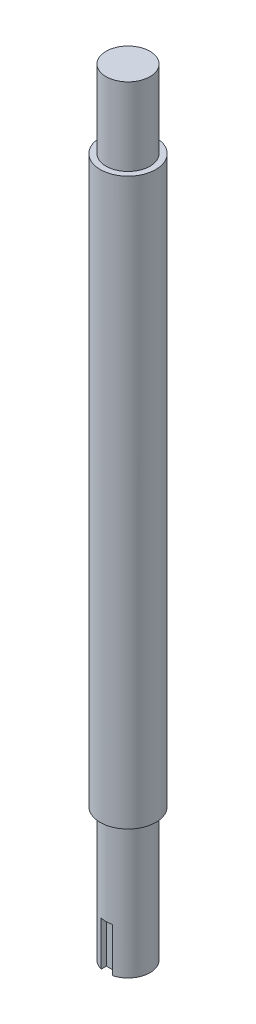
ISO-10303-21;
HEADER;
FILE_DESCRIPTION(('STEP AP214'),'2;1');
FILE_NAME('part.step','',(''),(''),'','','');
FILE_SCHEMA(('AUTOMOTIVE_DESIGN { 1 0 10303 214 1 1 1 1 }'));
ENDSEC;
DATA;
#1=APPLICATION_CONTEXT('core data for automotive mechanical design processes');
#2=APPLICATION_PROTOCOL_DEFINITION('international standard','automotive_design',2000,#1);
#3=PRODUCT_CONTEXT('',#1,'mechanical');
#4=PRODUCT('Part','Part','',(#3));
#5=PRODUCT_RELATED_PRODUCT_CATEGORY('part','',(#4));
#6=PRODUCT_DEFINITION_FORMATION('','',#4);
#7=PRODUCT_DEFINITION_CONTEXT('part definition',#1,'design');
#8=PRODUCT_DEFINITION('design','',#6,#7);
#9=PRODUCT_DEFINITION_SHAPE('','',#8);
#10=(LENGTH_UNIT() NAMED_UNIT(*) SI_UNIT(.MILLI.,.METRE.));
#11=(NAMED_UNIT(*) PLANE_ANGLE_UNIT() SI_UNIT($,.RADIAN.));
#12=(NAMED_UNIT(*) SI_UNIT($,.STERADIAN.) SOLID_ANGLE_UNIT());
#13=UNCERTAINTY_MEASURE_WITH_UNIT(LENGTH_MEASURE(1.E-05),#10,'distance_accuracy_value','');
#14=(GEOMETRIC_REPRESENTATION_CONTEXT(3) GLOBAL_UNCERTAINTY_ASSIGNED_CONTEXT((#13)) GLOBAL_UNIT_ASSIGNED_CONTEXT((#10,
#11,#12)) REPRESENTATION_CONTEXT('',''));
#15=CARTESIAN_POINT('',(0.,0.,0.));
#16=DIRECTION('',(0.,0.,1.));
#17=DIRECTION('',(1.,0.,0.));
#18=AXIS2_PLACEMENT_3D('',#15,#16,#17);
#19=CARTESIAN_POINT('',(0.,146.05,0.));
#20=DIRECTION('',(0.,1.,0.));
#21=DIRECTION('',(0.,0.,1.));
#22=AXIS2_PLACEMENT_3D('',#19,#20,#21);
#23=CYLINDRICAL_SURFACE('',#22,12.588875);
#24=CARTESIAN_POINT('',(0.,146.05,0.));
#25=DIRECTION('',(0.,1.,0.));
#26=DIRECTION('',(0.,0.,1.));
#27=AXIS2_PLACEMENT_3D('',#24,#25,#26);
#28=CIRCLE('',#27,12.588875);
#29=CARTESIAN_POINT('',(0.,146.05,12.588875));
#30=VERTEX_POINT('',#29);
#31=EDGE_CURVE('E150',#30,#30,#28,.T.);
#32=ORIENTED_EDGE('',*,*,#31,.T.);
#33=EDGE_LOOP('',(#32));
#34=FACE_BOUND('',#33,.T.);
#35=CARTESIAN_POINT('',(0.,190.5,0.));
#36=DIRECTION('',(0.,1.,0.));
#37=DIRECTION('',(0.,0.,1.));
#38=AXIS2_PLACEMENT_3D('',#35,#36,#37);
#39=CIRCLE('',#38,12.588875);
#40=CARTESIAN_POINT('',(0.,190.5,12.588875));
#41=VERTEX_POINT('',#40);
#42=EDGE_CURVE('E129',#41,#41,#39,.T.);
#43=ORIENTED_EDGE('',*,*,#42,.F.);
#44=EDGE_LOOP('',(#43));
#45=FACE_BOUND('',#44,.T.);
#46=ADVANCED_FACE('F52',(#34,#45),#23,.T.);
#47=CARTESIAN_POINT('',(0.,215.9,0.));
#48=DIRECTION('',(0.,-1.,0.));
#49=DIRECTION('',(0.,0.,-1.));
#50=AXIS2_PLACEMENT_3D('',#47,#48,#49);
#51=CYLINDRICAL_SURFACE('',#50,15.875);
#52=CARTESIAN_POINT('',(0.,146.05,0.));
#53=DIRECTION('',(0.,1.,0.));
#54=DIRECTION('',(0.,0.,1.));
#55=AXIS2_PLACEMENT_3D('',#52,#53,#54);
#56=CIRCLE('',#55,15.875);
#57=CARTESIAN_POINT('',(0.,146.05,15.875));
#58=VERTEX_POINT('',#57);
#59=EDGE_CURVE('E154',#58,#58,#56,.T.);
#60=ORIENTED_EDGE('',*,*,#59,.F.);
#61=EDGE_LOOP('',(#60));
#62=FACE_BOUND('',#61,.T.);
#63=CARTESIAN_POINT('',(0.,-177.8,0.));
#64=DIRECTION('',(0.,-1.,0.));
#65=DIRECTION('',(0.,0.,-1.));
#66=AXIS2_PLACEMENT_3D('',#63,#64,#65);
#67=CIRCLE('',#66,15.875);
#68=CARTESIAN_POINT('',(0.,-177.8,-15.875));
#69=VERTEX_POINT('',#68);
#70=EDGE_CURVE('E146',#69,#69,#67,.T.);
#71=ORIENTED_EDGE('',*,*,#70,.F.);
#72=EDGE_LOOP('',(#71));
#73=FACE_BOUND('',#72,.T.);
#74=ADVANCED_FACE('F54',(#62,#73),#51,.T.);
#75=CARTESIAN_POINT('',(0.,146.05,0.));
#76=DIRECTION('',(0.,1.,0.));
#77=DIRECTION('',(0.,0.,1.));
#78=AXIS2_PLACEMENT_3D('',#75,#76,#77);
#79=PLANE('',#78);
#80=ORIENTED_EDGE('',*,*,#31,.F.);
#81=EDGE_LOOP('',(#80));
#82=FACE_BOUND('',#81,.T.);
#83=ORIENTED_EDGE('',*,*,#59,.T.);
#84=EDGE_LOOP('',(#83));
#85=FACE_BOUND('',#84,.T.);
#86=ADVANCED_FACE('F171',(#82,#85),#79,.T.);
#87=CARTESIAN_POINT('',(0.,-177.8,0.));
#88=DIRECTION('',(0.,-1.,0.));
#89=DIRECTION('',(0.,0.,-1.));
#90=AXIS2_PLACEMENT_3D('',#87,#88,#89);
#91=PLANE('',#90);
#92=CARTESIAN_POINT('',(0.,-177.8,0.));
#93=DIRECTION('',(0.,-1.,0.));
#94=DIRECTION('',(0.,0.,-1.));
#95=AXIS2_PLACEMENT_3D('',#92,#93,#94);
#96=CIRCLE('',#95,12.588875);
#97=CARTESIAN_POINT('',(0.,-177.8,-12.588875));
#98=VERTEX_POINT('',#97);
#99=EDGE_CURVE('E142',#98,#98,#96,.T.);
#100=ORIENTED_EDGE('',*,*,#99,.F.);
#101=EDGE_LOOP('',(#100));
#102=FACE_BOUND('',#101,.T.);
#103=ORIENTED_EDGE('',*,*,#70,.T.);
#104=EDGE_LOOP('',(#103));
#105=FACE_BOUND('',#104,.T.);
#106=ADVANCED_FACE('F174',(#102,#105),#91,.T.);
#107=CARTESIAN_POINT('',(0.,-177.8,0.));
#108=DIRECTION('',(0.,-1.,0.));
#109=DIRECTION('',(0.,0.,-1.));
#110=AXIS2_PLACEMENT_3D('',#107,#108,#109);
#111=CYLINDRICAL_SURFACE('',#110,12.588875);
#112=DIRECTION('',(0.,-1.,0.));
#113=VECTOR('',#112,1.);
#114=CARTESIAN_POINT('',(3.17500000000003,-177.8,12.1819189278875));
#115=LINE('',#114,#113);
#116=CARTESIAN_POINT('',(3.17500000000003,-254.,12.1819189278875));
#117=VERTEX_POINT('',#116);
#118=CARTESIAN_POINT('',(3.17500000000003,-228.6,12.1819189278875));
#119=VERTEX_POINT('',#118);
#120=EDGE_CURVE('E81',#117,#119,#115,.F.);
#121=ORIENTED_EDGE('',*,*,#120,.F.);
#122=CARTESIAN_POINT('',(0.,-254.,0.));
#123=DIRECTION('',(0.,-1.,0.));
#124=DIRECTION('',(0.,0.,-1.));
#125=AXIS2_PLACEMENT_3D('',#122,#123,#124);
#126=CIRCLE('',#125,12.588875);
#127=CARTESIAN_POINT('',(-3.17500000000002,-254.,12.1819189278875));
#128=VERTEX_POINT('',#127);
#129=EDGE_CURVE('E138',#128,#117,#126,.T.);
#130=ORIENTED_EDGE('',*,*,#129,.F.);
#131=DIRECTION('',(0.,-1.,0.));
#132=VECTOR('',#131,1.);
#133=CARTESIAN_POINT('',(-3.17500000000002,-177.8,12.1819189278875));
#134=LINE('',#133,#132);
#135=CARTESIAN_POINT('',(-3.17500000000002,-228.6,12.1819189278875));
#136=VERTEX_POINT('',#135);
#137=EDGE_CURVE('E71',#136,#128,#134,.T.);
#138=ORIENTED_EDGE('',*,*,#137,.F.);
#139=CARTESIAN_POINT('',(0.,-228.6,0.));
#140=DIRECTION('',(0.,-1.,0.));
#141=DIRECTION('',(0.,0.,-1.));
#142=AXIS2_PLACEMENT_3D('',#139,#140,#141);
#143=CIRCLE('',#142,12.588875);
#144=EDGE_CURVE('E13',#136,#119,#143,.F.);
#145=ORIENTED_EDGE('',*,*,#144,.T.);
#146=EDGE_LOOP('',(#121,#130,#138,#145));
#147=FACE_BOUND('',#146,.T.);
#148=ORIENTED_EDGE('',*,*,#99,.T.);
#149=EDGE_LOOP('',(#148));
#150=FACE_BOUND('',#149,.T.);
#151=ADVANCED_FACE('F181',(#147,#150),#111,.T.);
#152=CARTESIAN_POINT('',(0.,-254.,0.));
#153=DIRECTION('',(0.,-1.,0.));
#154=DIRECTION('',(0.,0.,-1.));
#155=AXIS2_PLACEMENT_3D('',#152,#153,#154);
#156=PLANE('',#155);
#157=DIRECTION('',(0.,0.,1.));
#158=VECTOR('',#157,1.);
#159=CARTESIAN_POINT('',(3.17500000000006,-254.,15.706725));
#160=LINE('',#159,#158);
#161=CARTESIAN_POINT('',(3.17500000000001,-254.,9.229725));
#162=VERTEX_POINT('',#161);
#163=EDGE_CURVE('E125',#162,#117,#160,.T.);
#164=ORIENTED_EDGE('',*,*,#163,.F.);
#165=DIRECTION('',(1.,0.,0.));
#166=VECTOR('',#165,1.);
#167=CARTESIAN_POINT('',(-3.17499999999999,-254.,9.229725));
#168=LINE('',#167,#166);
#169=CARTESIAN_POINT('',(-3.17499999999999,-254.,9.229725));
#170=VERTEX_POINT('',#169);
#171=EDGE_CURVE('E128',#170,#162,#168,.T.);
#172=ORIENTED_EDGE('',*,*,#171,.F.);
#173=DIRECTION('',(0.,0.,-1.));
#174=VECTOR('',#173,1.);
#175=CARTESIAN_POINT('',(-3.17499999999992,-254.,0.));
#176=LINE('',#175,#174);
#177=EDGE_CURVE('E61',#128,#170,#176,.T.);
#178=ORIENTED_EDGE('',*,*,#177,.F.);
#179=ORIENTED_EDGE('',*,*,#129,.T.);
#180=EDGE_LOOP('',(#164,#172,#178,#179));
#181=FACE_BOUND('',#180,.T.);
#182=ADVANCED_FACE('F192',(#181),#156,.T.);
#183=CARTESIAN_POINT('',(3.17500000000006,-228.6,15.706725));
#184=DIRECTION('',(1.,0.,0.));
#185=DIRECTION('',(0.,0.,-1.));
#186=AXIS2_PLACEMENT_3D('',#183,#184,#185);
#187=PLANE('',#186);
#188=ORIENTED_EDGE('',*,*,#120,.T.);
#189=DIRECTION('',(0.,0.,1.));
#190=VECTOR('',#189,1.);
#191=CARTESIAN_POINT('',(3.17500000000006,-228.6,15.706725));
#192=LINE('',#191,#190);
#193=CARTESIAN_POINT('',(3.17500000000001,-228.6,9.229725));
#194=VERTEX_POINT('',#193);
#195=EDGE_CURVE('E109',#194,#119,#192,.T.);
#196=ORIENTED_EDGE('',*,*,#195,.F.);
#197=DIRECTION('',(0.,-1.,0.));
#198=VECTOR('',#197,1.);
#199=CARTESIAN_POINT('',(3.17500000000001,-228.6,9.229725));
#200=LINE('',#199,#198);
#201=EDGE_CURVE('E118',#194,#162,#200,.T.);
#202=ORIENTED_EDGE('',*,*,#201,.T.);
#203=ORIENTED_EDGE('',*,*,#163,.T.);
#204=EDGE_LOOP('',(#188,#196,#202,#203));
#205=FACE_BOUND('',#204,.T.);
#206=ADVANCED_FACE('F199',(#205),#187,.F.);
#207=CARTESIAN_POINT('',(-3.17499999999999,-228.6,9.229725));
#208=DIRECTION('',(0.,0.,-1.));
#209=DIRECTION('',(-1.,0.,0.));
#210=AXIS2_PLACEMENT_3D('',#207,#208,#209);
#211=PLANE('',#210);
#212=ORIENTED_EDGE('',*,*,#171,.T.);
#213=ORIENTED_EDGE('',*,*,#201,.F.);
#214=DIRECTION('',(1.,0.,0.));
#215=VECTOR('',#214,1.);
#216=CARTESIAN_POINT('',(-3.17499999999999,-228.6,9.229725));
#217=LINE('',#216,#215);
#218=CARTESIAN_POINT('',(-3.17499999999999,-228.6,9.229725));
#219=VERTEX_POINT('',#218);
#220=EDGE_CURVE('E107',#219,#194,#217,.T.);
#221=ORIENTED_EDGE('',*,*,#220,.F.);
#222=DIRECTION('',(0.,-1.,0.));
#223=VECTOR('',#222,1.);
#224=CARTESIAN_POINT('',(-3.17499999999999,-228.6,9.229725));
#225=LINE('',#224,#223);
#226=EDGE_CURVE('E112',#219,#170,#225,.T.);
#227=ORIENTED_EDGE('',*,*,#226,.T.);
#228=EDGE_LOOP('',(#212,#213,#221,#227));
#229=FACE_BOUND('',#228,.T.);
#230=ADVANCED_FACE('F120',(#229),#211,.F.);
#231=CARTESIAN_POINT('',(-3.17500000000005,-228.6,15.706725));
#232=DIRECTION('',(-1.,0.,0.));
#233=DIRECTION('',(0.,0.,1.));
#234=AXIS2_PLACEMENT_3D('',#231,#232,#233);
#235=PLANE('',#234);
#236=ORIENTED_EDGE('',*,*,#137,.T.);
#237=ORIENTED_EDGE('',*,*,#177,.T.);
#238=ORIENTED_EDGE('',*,*,#226,.F.);
#239=DIRECTION('',(0.,0.,-1.));
#240=VECTOR('',#239,1.);
#241=CARTESIAN_POINT('',(-3.17500000000005,-228.6,15.706725));
#242=LINE('',#241,#240);
#243=EDGE_CURVE('E103',#136,#219,#242,.T.);
#244=ORIENTED_EDGE('',*,*,#243,.F.);
#245=EDGE_LOOP('',(#236,#237,#238,#244));
#246=FACE_BOUND('',#245,.T.);
#247=ADVANCED_FACE('F113',(#246),#235,.F.);
#248=CARTESIAN_POINT('',(0.,-228.6,0.));
#249=DIRECTION('',(0.,-1.,0.));
#250=DIRECTION('',(0.,0.,-1.));
#251=AXIS2_PLACEMENT_3D('',#248,#249,#250);
#252=PLANE('',#251);
#253=ORIENTED_EDGE('',*,*,#243,.T.);
#254=ORIENTED_EDGE('',*,*,#220,.T.);
#255=ORIENTED_EDGE('',*,*,#195,.T.);
#256=ORIENTED_EDGE('',*,*,#144,.F.);
#257=EDGE_LOOP('',(#253,#254,#255,#256));
#258=FACE_BOUND('',#257,.T.);
#259=ADVANCED_FACE('F105',(#258),#252,.T.);
#260=CARTESIAN_POINT('',(0.,190.5,0.));
#261=DIRECTION('',(0.,1.,0.));
#262=DIRECTION('',(0.,0.,1.));
#263=AXIS2_PLACEMENT_3D('',#260,#261,#262);
#264=PLANE('',#263);
#265=ORIENTED_EDGE('',*,*,#42,.T.);
#266=EDGE_LOOP('',(#265));
#267=FACE_BOUND('',#266,.T.);
#268=ADVANCED_FACE('F163',(#267),#264,.T.);
#269=CLOSED_SHELL('',(#46,#74,#86,#106,#151,#182,#206,#230,#247,#259,#268));
#270=MANIFOLD_SOLID_BREP('B2',#269);
#271=ADVANCED_BREP_SHAPE_REPRESENTATION('',(#18,#270),#14);
#272=SHAPE_DEFINITION_REPRESENTATION(#9,#271);
ENDSEC;
END-ISO-10303-21;
